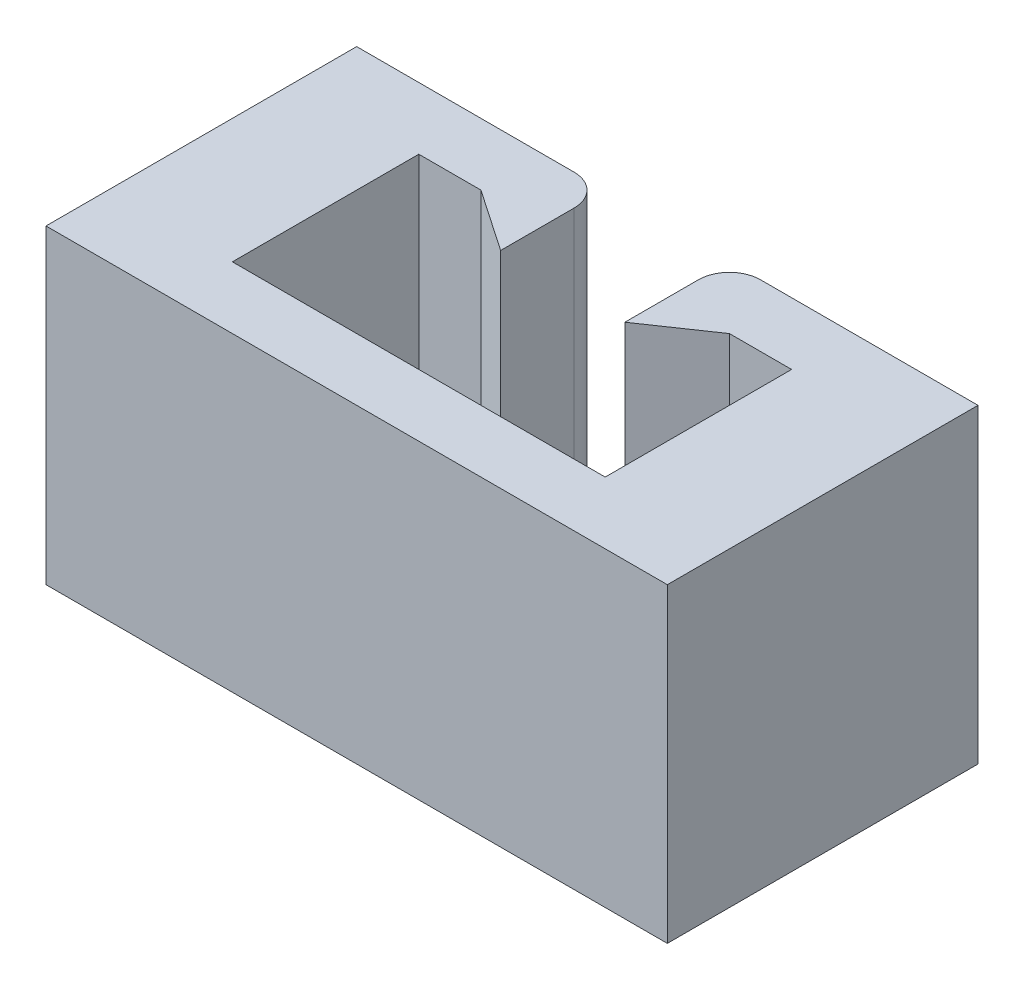
ISO-10303-21;
HEADER;
FILE_DESCRIPTION(('STEP AP214'),'2;1');
FILE_NAME('part.step','',(''),(''),'','','');
FILE_SCHEMA(('AUTOMOTIVE_DESIGN { 1 0 10303 214 1 1 1 1 }'));
ENDSEC;
DATA;
#1=APPLICATION_CONTEXT('core data for automotive mechanical design processes');
#2=APPLICATION_PROTOCOL_DEFINITION('international standard','automotive_design',2000,#1);
#3=PRODUCT_CONTEXT('',#1,'mechanical');
#4=PRODUCT('Part','Part','',(#3));
#5=PRODUCT_RELATED_PRODUCT_CATEGORY('part','',(#4));
#6=PRODUCT_DEFINITION_FORMATION('','',#4);
#7=PRODUCT_DEFINITION_CONTEXT('part definition',#1,'design');
#8=PRODUCT_DEFINITION('design','',#6,#7);
#9=PRODUCT_DEFINITION_SHAPE('','',#8);
#10=(LENGTH_UNIT() NAMED_UNIT(*) SI_UNIT(.MILLI.,.METRE.));
#11=(NAMED_UNIT(*) PLANE_ANGLE_UNIT() SI_UNIT($,.RADIAN.));
#12=(NAMED_UNIT(*) SI_UNIT($,.STERADIAN.) SOLID_ANGLE_UNIT());
#13=UNCERTAINTY_MEASURE_WITH_UNIT(LENGTH_MEASURE(1.E-05),#10,'distance_accuracy_value','');
#14=(GEOMETRIC_REPRESENTATION_CONTEXT(3) GLOBAL_UNCERTAINTY_ASSIGNED_CONTEXT((#13)) GLOBAL_UNIT_ASSIGNED_CONTEXT((#10,
#11,#12)) REPRESENTATION_CONTEXT('',''));
#15=CARTESIAN_POINT('',(0.,0.,0.));
#16=DIRECTION('',(0.,0.,1.));
#17=DIRECTION('',(1.,0.,0.));
#18=AXIS2_PLACEMENT_3D('',#15,#16,#17);
#19=CARTESIAN_POINT('',(1.5,5.,-2.5));
#20=DIRECTION('',(0.,0.,1.));
#21=DIRECTION('',(1.,0.,0.));
#22=AXIS2_PLACEMENT_3D('',#19,#20,#21);
#23=PLANE('',#22);
#24=DIRECTION('',(-1.,0.,0.));
#25=VECTOR('',#24,1.);
#26=CARTESIAN_POINT('',(1.5,0.,-2.5));
#27=LINE('',#26,#25);
#28=CARTESIAN_POINT('',(5.,0.,-2.5));
#29=VERTEX_POINT('',#28);
#30=CARTESIAN_POINT('',(1.5,0.,-2.5));
#31=VERTEX_POINT('',#30);
#32=EDGE_CURVE('E188',#29,#31,#27,.T.);
#33=ORIENTED_EDGE('',*,*,#32,.T.);
#34=DIRECTION('',(0.,-1.,0.));
#35=VECTOR('',#34,1.);
#36=CARTESIAN_POINT('',(1.5,5.,-2.5));
#37=LINE('',#36,#35);
#38=CARTESIAN_POINT('',(1.5,5.,-2.5));
#39=VERTEX_POINT('',#38);
#40=EDGE_CURVE('E11',#39,#31,#37,.T.);
#41=ORIENTED_EDGE('',*,*,#40,.F.);
#42=DIRECTION('',(-1.,0.,0.));
#43=VECTOR('',#42,1.);
#44=CARTESIAN_POINT('',(1.5,5.,-2.5));
#45=LINE('',#44,#43);
#46=CARTESIAN_POINT('',(5.,5.,-2.5));
#47=VERTEX_POINT('',#46);
#48=EDGE_CURVE('E236',#47,#39,#45,.T.);
#49=ORIENTED_EDGE('',*,*,#48,.F.);
#50=DIRECTION('',(0.,-1.,0.));
#51=VECTOR('',#50,1.);
#52=CARTESIAN_POINT('',(5.,5.,-2.5));
#53=LINE('',#52,#51);
#54=EDGE_CURVE('E184',#47,#29,#53,.T.);
#55=ORIENTED_EDGE('',*,*,#54,.T.);
#56=EDGE_LOOP('',(#33,#41,#49,#55));
#57=FACE_BOUND('',#56,.T.);
#58=ADVANCED_FACE('F39',(#57),#23,.F.);
#59=CARTESIAN_POINT('',(1.5,5.,-2.));
#60=DIRECTION('',(0.,-1.,0.));
#61=DIRECTION('',(0.,0.,-1.));
#62=AXIS2_PLACEMENT_3D('',#59,#60,#61);
#63=CYLINDRICAL_SURFACE('',#62,0.5);
#64=CARTESIAN_POINT('',(1.5,0.,-2.));
#65=DIRECTION('',(0.,1.,0.));
#66=DIRECTION('',(0.,0.,1.));
#67=AXIS2_PLACEMENT_3D('',#64,#65,#66);
#68=CIRCLE('',#67,0.5);
#69=CARTESIAN_POINT('',(1.,0.,-2.));
#70=VERTEX_POINT('',#69);
#71=EDGE_CURVE('E192',#31,#70,#68,.T.);
#72=ORIENTED_EDGE('',*,*,#71,.T.);
#73=DIRECTION('',(0.,-1.,0.));
#74=VECTOR('',#73,1.);
#75=CARTESIAN_POINT('',(1.,5.,-2.));
#76=LINE('',#75,#74);
#77=CARTESIAN_POINT('',(1.,5.,-2.));
#78=VERTEX_POINT('',#77);
#79=EDGE_CURVE('E48',#78,#70,#76,.T.);
#80=ORIENTED_EDGE('',*,*,#79,.F.);
#81=CARTESIAN_POINT('',(1.5,5.,-2.));
#82=DIRECTION('',(0.,1.,0.));
#83=DIRECTION('',(0.,0.,1.));
#84=AXIS2_PLACEMENT_3D('',#81,#82,#83);
#85=CIRCLE('',#84,0.5);
#86=EDGE_CURVE('E123',#39,#78,#85,.T.);
#87=ORIENTED_EDGE('',*,*,#86,.F.);
#88=ORIENTED_EDGE('',*,*,#40,.T.);
#89=EDGE_LOOP('',(#72,#80,#87,#88));
#90=FACE_BOUND('',#89,.T.);
#91=ADVANCED_FACE('F289',(#90),#63,.T.);
#92=CARTESIAN_POINT('',(1.,5.,-1.5));
#93=DIRECTION('',(1.,0.,0.));
#94=DIRECTION('',(0.,0.,-1.));
#95=AXIS2_PLACEMENT_3D('',#92,#93,#94);
#96=PLANE('',#95);
#97=DIRECTION('',(0.,0.,1.));
#98=VECTOR('',#97,1.);
#99=CARTESIAN_POINT('',(1.,0.,-1.5));
#100=LINE('',#99,#98);
#101=CARTESIAN_POINT('',(1.,0.,-0.817081844494731));
#102=VERTEX_POINT('',#101);
#103=EDGE_CURVE('E196',#70,#102,#100,.T.);
#104=ORIENTED_EDGE('',*,*,#103,.T.);
#105=DIRECTION('',(0.,-1.,0.));
#106=VECTOR('',#105,1.);
#107=CARTESIAN_POINT('',(1.,5.,-0.817081844494731));
#108=LINE('',#107,#106);
#109=CARTESIAN_POINT('',(1.,5.,-0.817081844494731));
#110=VERTEX_POINT('',#109);
#111=EDGE_CURVE('E279',#110,#102,#108,.T.);
#112=ORIENTED_EDGE('',*,*,#111,.F.);
#113=DIRECTION('',(0.,0.,1.));
#114=VECTOR('',#113,1.);
#115=CARTESIAN_POINT('',(1.,5.,-1.5));
#116=LINE('',#115,#114);
#117=EDGE_CURVE('E288',#78,#110,#116,.T.);
#118=ORIENTED_EDGE('',*,*,#117,.F.);
#119=ORIENTED_EDGE('',*,*,#79,.T.);
#120=EDGE_LOOP('',(#104,#112,#118,#119));
#121=FACE_BOUND('',#120,.T.);
#122=ADVANCED_FACE('F286',(#121),#96,.F.);
#123=CARTESIAN_POINT('',(1.,5.,-0.817081844494731));
#124=DIRECTION('',(-0.563956761474712,0.,-0.825804317733297));
#125=DIRECTION('',(-0.825804317733297,0.,0.563956761474712));
#126=AXIS2_PLACEMENT_3D('',#123,#124,#125);
#127=PLANE('',#126);
#128=DIRECTION('',(0.825804317733296,0.,-0.563956761474712));
#129=VECTOR('',#128,1.);
#130=CARTESIAN_POINT('',(1.,0.,-0.817081844494731));
#131=LINE('',#130,#129);
#132=CARTESIAN_POINT('',(2.,0.,-1.5));
#133=VERTEX_POINT('',#132);
#134=EDGE_CURVE('E199',#102,#133,#131,.T.);
#135=ORIENTED_EDGE('',*,*,#134,.T.);
#136=DIRECTION('',(0.,-1.,0.));
#137=VECTOR('',#136,1.);
#138=CARTESIAN_POINT('',(2.,5.,-1.5));
#139=LINE('',#138,#137);
#140=CARTESIAN_POINT('',(2.,5.,-1.5));
#141=VERTEX_POINT('',#140);
#142=EDGE_CURVE('E275',#141,#133,#139,.T.);
#143=ORIENTED_EDGE('',*,*,#142,.F.);
#144=DIRECTION('',(0.825804317733296,0.,-0.563956761474712));
#145=VECTOR('',#144,1.);
#146=CARTESIAN_POINT('',(1.,5.,-0.817081844494731));
#147=LINE('',#146,#145);
#148=EDGE_CURVE('E309',#110,#141,#147,.T.);
#149=ORIENTED_EDGE('',*,*,#148,.F.);
#150=ORIENTED_EDGE('',*,*,#111,.T.);
#151=EDGE_LOOP('',(#135,#143,#149,#150));
#152=FACE_BOUND('',#151,.T.);
#153=ADVANCED_FACE('F299',(#152),#127,.F.);
#154=CARTESIAN_POINT('',(2.,5.,-1.5));
#155=DIRECTION('',(0.,0.,-1.));
#156=DIRECTION('',(-1.,0.,0.));
#157=AXIS2_PLACEMENT_3D('',#154,#155,#156);
#158=PLANE('',#157);
#159=DIRECTION('',(1.,0.,0.));
#160=VECTOR('',#159,1.);
#161=CARTESIAN_POINT('',(2.,0.,-1.5));
#162=LINE('',#161,#160);
#163=CARTESIAN_POINT('',(3.,0.,-1.5));
#164=VERTEX_POINT('',#163);
#165=EDGE_CURVE('E202',#133,#164,#162,.T.);
#166=ORIENTED_EDGE('',*,*,#165,.T.);
#167=DIRECTION('',(0.,-1.,0.));
#168=VECTOR('',#167,1.);
#169=CARTESIAN_POINT('',(3.,5.,-1.5));
#170=LINE('',#169,#168);
#171=CARTESIAN_POINT('',(3.,5.,-1.5));
#172=VERTEX_POINT('',#171);
#173=EDGE_CURVE('E271',#172,#164,#170,.T.);
#174=ORIENTED_EDGE('',*,*,#173,.F.);
#175=DIRECTION('',(1.,0.,0.));
#176=VECTOR('',#175,1.);
#177=CARTESIAN_POINT('',(2.,5.,-1.5));
#178=LINE('',#177,#176);
#179=EDGE_CURVE('E305',#141,#172,#178,.T.);
#180=ORIENTED_EDGE('',*,*,#179,.F.);
#181=ORIENTED_EDGE('',*,*,#142,.T.);
#182=EDGE_LOOP('',(#166,#174,#180,#181));
#183=FACE_BOUND('',#182,.T.);
#184=ADVANCED_FACE('F303',(#183),#158,.F.);
#185=CARTESIAN_POINT('',(3.,5.,-1.5));
#186=DIRECTION('',(1.,0.,0.));
#187=DIRECTION('',(0.,0.,-1.));
#188=AXIS2_PLACEMENT_3D('',#185,#186,#187);
#189=PLANE('',#188);
#190=DIRECTION('',(0.,0.,1.));
#191=VECTOR('',#190,1.);
#192=CARTESIAN_POINT('',(3.,0.,-1.5));
#193=LINE('',#192,#191);
#194=CARTESIAN_POINT('',(3.,0.,1.5));
#195=VERTEX_POINT('',#194);
#196=EDGE_CURVE('E205',#164,#195,#193,.T.);
#197=ORIENTED_EDGE('',*,*,#196,.T.);
#198=DIRECTION('',(0.,-1.,0.));
#199=VECTOR('',#198,1.);
#200=CARTESIAN_POINT('',(3.,5.,1.5));
#201=LINE('',#200,#199);
#202=CARTESIAN_POINT('',(3.,5.,1.5));
#203=VERTEX_POINT('',#202);
#204=EDGE_CURVE('E267',#203,#195,#201,.T.);
#205=ORIENTED_EDGE('',*,*,#204,.F.);
#206=DIRECTION('',(0.,0.,1.));
#207=VECTOR('',#206,1.);
#208=CARTESIAN_POINT('',(3.,5.,-1.5));
#209=LINE('',#208,#207);
#210=EDGE_CURVE('E308',#172,#203,#209,.T.);
#211=ORIENTED_EDGE('',*,*,#210,.F.);
#212=ORIENTED_EDGE('',*,*,#173,.T.);
#213=EDGE_LOOP('',(#197,#205,#211,#212));
#214=FACE_BOUND('',#213,.T.);
#215=ADVANCED_FACE('F462',(#214),#189,.F.);
#216=CARTESIAN_POINT('',(-3.,5.,1.5));
#217=DIRECTION('',(0.,0.,1.));
#218=DIRECTION('',(1.,0.,0.));
#219=AXIS2_PLACEMENT_3D('',#216,#217,#218);
#220=PLANE('',#219);
#221=DIRECTION('',(-1.,0.,0.));
#222=VECTOR('',#221,1.);
#223=CARTESIAN_POINT('',(-3.,0.,1.5));
#224=LINE('',#223,#222);
#225=CARTESIAN_POINT('',(-3.,0.,1.5));
#226=VERTEX_POINT('',#225);
#227=EDGE_CURVE('E208',#195,#226,#224,.T.);
#228=ORIENTED_EDGE('',*,*,#227,.T.);
#229=DIRECTION('',(0.,-1.,0.));
#230=VECTOR('',#229,1.);
#231=CARTESIAN_POINT('',(-3.,5.,1.5));
#232=LINE('',#231,#230);
#233=CARTESIAN_POINT('',(-3.,5.,1.5));
#234=VERTEX_POINT('',#233);
#235=EDGE_CURVE('E263',#234,#226,#232,.T.);
#236=ORIENTED_EDGE('',*,*,#235,.F.);
#237=DIRECTION('',(-1.,0.,0.));
#238=VECTOR('',#237,1.);
#239=CARTESIAN_POINT('',(-3.,5.,1.5));
#240=LINE('',#239,#238);
#241=EDGE_CURVE('E313',#203,#234,#240,.T.);
#242=ORIENTED_EDGE('',*,*,#241,.F.);
#243=ORIENTED_EDGE('',*,*,#204,.T.);
#244=EDGE_LOOP('',(#228,#236,#242,#243));
#245=FACE_BOUND('',#244,.T.);
#246=ADVANCED_FACE('F452',(#245),#220,.F.);
#247=CARTESIAN_POINT('',(-3.,5.,-1.5));
#248=DIRECTION('',(-1.,0.,0.));
#249=DIRECTION('',(0.,0.,1.));
#250=AXIS2_PLACEMENT_3D('',#247,#248,#249);
#251=PLANE('',#250);
#252=DIRECTION('',(0.,0.,-1.));
#253=VECTOR('',#252,1.);
#254=CARTESIAN_POINT('',(-3.,0.,-1.5));
#255=LINE('',#254,#253);
#256=CARTESIAN_POINT('',(-3.,0.,-1.5));
#257=VERTEX_POINT('',#256);
#258=EDGE_CURVE('E211',#226,#257,#255,.T.);
#259=ORIENTED_EDGE('',*,*,#258,.T.);
#260=DIRECTION('',(0.,-1.,0.));
#261=VECTOR('',#260,1.);
#262=CARTESIAN_POINT('',(-3.,5.,-1.5));
#263=LINE('',#262,#261);
#264=CARTESIAN_POINT('',(-3.,5.,-1.5));
#265=VERTEX_POINT('',#264);
#266=EDGE_CURVE('E259',#265,#257,#263,.T.);
#267=ORIENTED_EDGE('',*,*,#266,.F.);
#268=DIRECTION('',(0.,0.,-1.));
#269=VECTOR('',#268,1.);
#270=CARTESIAN_POINT('',(-3.,5.,-1.5));
#271=LINE('',#270,#269);
#272=EDGE_CURVE('E320',#234,#265,#271,.T.);
#273=ORIENTED_EDGE('',*,*,#272,.F.);
#274=ORIENTED_EDGE('',*,*,#235,.T.);
#275=EDGE_LOOP('',(#259,#267,#273,#274));
#276=FACE_BOUND('',#275,.T.);
#277=ADVANCED_FACE('F442',(#276),#251,.F.);
#278=CARTESIAN_POINT('',(-3.,5.,-1.5));
#279=DIRECTION('',(0.,0.,-1.));
#280=DIRECTION('',(-1.,0.,0.));
#281=AXIS2_PLACEMENT_3D('',#278,#279,#280);
#282=PLANE('',#281);
#283=DIRECTION('',(1.,0.,0.));
#284=VECTOR('',#283,1.);
#285=CARTESIAN_POINT('',(-3.,0.,-1.5));
#286=LINE('',#285,#284);
#287=CARTESIAN_POINT('',(-2.,0.,-1.5));
#288=VERTEX_POINT('',#287);
#289=EDGE_CURVE('E214',#257,#288,#286,.T.);
#290=ORIENTED_EDGE('',*,*,#289,.T.);
#291=DIRECTION('',(0.,-1.,0.));
#292=VECTOR('',#291,1.);
#293=CARTESIAN_POINT('',(-2.,5.,-1.5));
#294=LINE('',#293,#292);
#295=CARTESIAN_POINT('',(-2.,5.,-1.5));
#296=VERTEX_POINT('',#295);
#297=EDGE_CURVE('E255',#296,#288,#294,.T.);
#298=ORIENTED_EDGE('',*,*,#297,.F.);
#299=DIRECTION('',(1.,0.,0.));
#300=VECTOR('',#299,1.);
#301=CARTESIAN_POINT('',(-3.,5.,-1.5));
#302=LINE('',#301,#300);
#303=EDGE_CURVE('E323',#265,#296,#302,.T.);
#304=ORIENTED_EDGE('',*,*,#303,.F.);
#305=ORIENTED_EDGE('',*,*,#266,.T.);
#306=EDGE_LOOP('',(#290,#298,#304,#305));
#307=FACE_BOUND('',#306,.T.);
#308=ADVANCED_FACE('F361',(#307),#282,.F.);
#309=CARTESIAN_POINT('',(-1.,5.,-0.817081844494731));
#310=DIRECTION('',(0.563956761474712,0.,-0.825804317733296));
#311=DIRECTION('',(-0.825804317733296,0.,-0.563956761474712));
#312=AXIS2_PLACEMENT_3D('',#309,#310,#311);
#313=PLANE('',#312);
#314=DIRECTION('',(0.825804317733296,0.,0.563956761474712));
#315=VECTOR('',#314,1.);
#316=CARTESIAN_POINT('',(-1.,0.,-0.817081844494731));
#317=LINE('',#316,#315);
#318=CARTESIAN_POINT('',(-1.,0.,-0.817081844494731));
#319=VERTEX_POINT('',#318);
#320=EDGE_CURVE('E217',#288,#319,#317,.T.);
#321=ORIENTED_EDGE('',*,*,#320,.T.);
#322=DIRECTION('',(0.,-1.,0.));
#323=VECTOR('',#322,1.);
#324=CARTESIAN_POINT('',(-1.,5.,-0.817081844494731));
#325=LINE('',#324,#323);
#326=CARTESIAN_POINT('',(-1.,5.,-0.817081844494731));
#327=VERTEX_POINT('',#326);
#328=EDGE_CURVE('E251',#327,#319,#325,.T.);
#329=ORIENTED_EDGE('',*,*,#328,.F.);
#330=DIRECTION('',(0.825804317733296,0.,0.563956761474712));
#331=VECTOR('',#330,1.);
#332=CARTESIAN_POINT('',(-1.,5.,-0.817081844494731));
#333=LINE('',#332,#331);
#334=EDGE_CURVE('E326',#296,#327,#333,.T.);
#335=ORIENTED_EDGE('',*,*,#334,.F.);
#336=ORIENTED_EDGE('',*,*,#297,.T.);
#337=EDGE_LOOP('',(#321,#329,#335,#336));
#338=FACE_BOUND('',#337,.T.);
#339=ADVANCED_FACE('F350',(#338),#313,.F.);
#340=CARTESIAN_POINT('',(-1.,5.,-1.5));
#341=DIRECTION('',(-1.,0.,0.));
#342=DIRECTION('',(0.,0.,1.));
#343=AXIS2_PLACEMENT_3D('',#340,#341,#342);
#344=PLANE('',#343);
#345=DIRECTION('',(0.,0.,-1.));
#346=VECTOR('',#345,1.);
#347=CARTESIAN_POINT('',(-1.,0.,-1.5));
#348=LINE('',#347,#346);
#349=CARTESIAN_POINT('',(-1.,0.,-2.));
#350=VERTEX_POINT('',#349);
#351=EDGE_CURVE('E221',#319,#350,#348,.T.);
#352=ORIENTED_EDGE('',*,*,#351,.T.);
#353=DIRECTION('',(0.,-1.,0.));
#354=VECTOR('',#353,1.);
#355=CARTESIAN_POINT('',(-1.,5.,-2.));
#356=LINE('',#355,#354);
#357=CARTESIAN_POINT('',(-1.,5.,-2.));
#358=VERTEX_POINT('',#357);
#359=EDGE_CURVE('E247',#358,#350,#356,.T.);
#360=ORIENTED_EDGE('',*,*,#359,.F.);
#361=DIRECTION('',(0.,0.,-1.));
#362=VECTOR('',#361,1.);
#363=CARTESIAN_POINT('',(-1.,5.,-1.5));
#364=LINE('',#363,#362);
#365=EDGE_CURVE('E329',#327,#358,#364,.T.);
#366=ORIENTED_EDGE('',*,*,#365,.F.);
#367=ORIENTED_EDGE('',*,*,#328,.T.);
#368=EDGE_LOOP('',(#352,#360,#366,#367));
#369=FACE_BOUND('',#368,.T.);
#370=ADVANCED_FACE('F353',(#369),#344,.F.);
#371=CARTESIAN_POINT('',(-1.5,5.,-2.));
#372=DIRECTION('',(0.,-1.,0.));
#373=DIRECTION('',(0.,0.,-1.));
#374=AXIS2_PLACEMENT_3D('',#371,#372,#373);
#375=CYLINDRICAL_SURFACE('',#374,0.5);
#376=CARTESIAN_POINT('',(-1.5,0.,-2.));
#377=DIRECTION('',(0.,1.,0.));
#378=DIRECTION('',(0.,0.,1.));
#379=AXIS2_PLACEMENT_3D('',#376,#377,#378);
#380=CIRCLE('',#379,0.5);
#381=CARTESIAN_POINT('',(-1.5,0.,-2.5));
#382=VERTEX_POINT('',#381);
#383=EDGE_CURVE('E224',#350,#382,#380,.T.);
#384=ORIENTED_EDGE('',*,*,#383,.T.);
#385=DIRECTION('',(0.,-1.,0.));
#386=VECTOR('',#385,1.);
#387=CARTESIAN_POINT('',(-1.5,5.,-2.5));
#388=LINE('',#387,#386);
#389=CARTESIAN_POINT('',(-1.5,5.,-2.5));
#390=VERTEX_POINT('',#389);
#391=EDGE_CURVE('E243',#390,#382,#388,.T.);
#392=ORIENTED_EDGE('',*,*,#391,.F.);
#393=CARTESIAN_POINT('',(-1.5,5.,-2.));
#394=DIRECTION('',(0.,1.,0.));
#395=DIRECTION('',(0.,0.,1.));
#396=AXIS2_PLACEMENT_3D('',#393,#394,#395);
#397=CIRCLE('',#396,0.5);
#398=EDGE_CURVE('E332',#358,#390,#397,.T.);
#399=ORIENTED_EDGE('',*,*,#398,.F.);
#400=ORIENTED_EDGE('',*,*,#359,.T.);
#401=EDGE_LOOP('',(#384,#392,#399,#400));
#402=FACE_BOUND('',#401,.T.);
#403=ADVANCED_FACE('F340',(#402),#375,.T.);
#404=CARTESIAN_POINT('',(-5.,5.,-2.5));
#405=DIRECTION('',(0.,0.,1.));
#406=DIRECTION('',(1.,0.,0.));
#407=AXIS2_PLACEMENT_3D('',#404,#405,#406);
#408=PLANE('',#407);
#409=DIRECTION('',(-1.,0.,0.));
#410=VECTOR('',#409,1.);
#411=CARTESIAN_POINT('',(-5.,0.,-2.5));
#412=LINE('',#411,#410);
#413=CARTESIAN_POINT('',(-5.,0.,-2.5));
#414=VERTEX_POINT('',#413);
#415=EDGE_CURVE('E227',#382,#414,#412,.T.);
#416=ORIENTED_EDGE('',*,*,#415,.T.);
#417=DIRECTION('',(0.,-1.,0.));
#418=VECTOR('',#417,1.);
#419=CARTESIAN_POINT('',(-5.,5.,-2.5));
#420=LINE('',#419,#418);
#421=CARTESIAN_POINT('',(-5.,5.,-2.5));
#422=VERTEX_POINT('',#421);
#423=EDGE_CURVE('E177',#422,#414,#420,.T.);
#424=ORIENTED_EDGE('',*,*,#423,.F.);
#425=DIRECTION('',(-1.,0.,0.));
#426=VECTOR('',#425,1.);
#427=CARTESIAN_POINT('',(-5.,5.,-2.5));
#428=LINE('',#427,#426);
#429=EDGE_CURVE('E166',#390,#422,#428,.T.);
#430=ORIENTED_EDGE('',*,*,#429,.F.);
#431=ORIENTED_EDGE('',*,*,#391,.T.);
#432=EDGE_LOOP('',(#416,#424,#430,#431));
#433=FACE_BOUND('',#432,.T.);
#434=ADVANCED_FACE('F344',(#433),#408,.F.);
#435=CARTESIAN_POINT('',(-5.,5.,2.5));
#436=DIRECTION('',(1.,0.,0.));
#437=DIRECTION('',(0.,0.,-1.));
#438=AXIS2_PLACEMENT_3D('',#435,#436,#437);
#439=PLANE('',#438);
#440=DIRECTION('',(0.,0.,1.));
#441=VECTOR('',#440,1.);
#442=CARTESIAN_POINT('',(-5.,0.,2.5));
#443=LINE('',#442,#441);
#444=CARTESIAN_POINT('',(-5.,0.,2.5));
#445=VERTEX_POINT('',#444);
#446=EDGE_CURVE('E175',#414,#445,#443,.T.);
#447=ORIENTED_EDGE('',*,*,#446,.T.);
#448=DIRECTION('',(0.,-1.,0.));
#449=VECTOR('',#448,1.);
#450=CARTESIAN_POINT('',(-5.,5.,2.5));
#451=LINE('',#450,#449);
#452=CARTESIAN_POINT('',(-5.,5.,2.5));
#453=VERTEX_POINT('',#452);
#454=EDGE_CURVE('E172',#453,#445,#451,.T.);
#455=ORIENTED_EDGE('',*,*,#454,.F.);
#456=DIRECTION('',(0.,0.,1.));
#457=VECTOR('',#456,1.);
#458=CARTESIAN_POINT('',(-5.,5.,2.5));
#459=LINE('',#458,#457);
#460=EDGE_CURVE('E160',#422,#453,#459,.T.);
#461=ORIENTED_EDGE('',*,*,#460,.F.);
#462=ORIENTED_EDGE('',*,*,#423,.T.);
#463=EDGE_LOOP('',(#447,#455,#461,#462));
#464=FACE_BOUND('',#463,.T.);
#465=ADVANCED_FACE('F173',(#464),#439,.F.);
#466=CARTESIAN_POINT('',(-5.,5.,2.5));
#467=DIRECTION('',(0.,0.,-1.));
#468=DIRECTION('',(-1.,0.,0.));
#469=AXIS2_PLACEMENT_3D('',#466,#467,#468);
#470=PLANE('',#469);
#471=DIRECTION('',(1.,0.,0.));
#472=VECTOR('',#471,1.);
#473=CARTESIAN_POINT('',(-5.,0.,2.5));
#474=LINE('',#473,#472);
#475=CARTESIAN_POINT('',(5.,0.,2.5));
#476=VERTEX_POINT('',#475);
#477=EDGE_CURVE('E109',#445,#476,#474,.T.);
#478=ORIENTED_EDGE('',*,*,#477,.T.);
#479=DIRECTION('',(0.,-1.,0.));
#480=VECTOR('',#479,1.);
#481=CARTESIAN_POINT('',(5.,5.,2.5));
#482=LINE('',#481,#480);
#483=CARTESIAN_POINT('',(5.,5.,2.5));
#484=VERTEX_POINT('',#483);
#485=EDGE_CURVE('E178',#484,#476,#482,.T.);
#486=ORIENTED_EDGE('',*,*,#485,.F.);
#487=DIRECTION('',(1.,0.,0.));
#488=VECTOR('',#487,1.);
#489=CARTESIAN_POINT('',(-5.,5.,2.5));
#490=LINE('',#489,#488);
#491=EDGE_CURVE('E164',#453,#484,#490,.T.);
#492=ORIENTED_EDGE('',*,*,#491,.F.);
#493=ORIENTED_EDGE('',*,*,#454,.T.);
#494=EDGE_LOOP('',(#478,#486,#492,#493));
#495=FACE_BOUND('',#494,.T.);
#496=ADVANCED_FACE('F180',(#495),#470,.F.);
#497=CARTESIAN_POINT('',(5.,5.,2.5));
#498=DIRECTION('',(-1.,0.,0.));
#499=DIRECTION('',(0.,0.,1.));
#500=AXIS2_PLACEMENT_3D('',#497,#498,#499);
#501=PLANE('',#500);
#502=DIRECTION('',(0.,0.,-1.));
#503=VECTOR('',#502,1.);
#504=CARTESIAN_POINT('',(5.,0.,2.5));
#505=LINE('',#504,#503);
#506=EDGE_CURVE('E115',#476,#29,#505,.T.);
#507=ORIENTED_EDGE('',*,*,#506,.T.);
#508=ORIENTED_EDGE('',*,*,#54,.F.);
#509=DIRECTION('',(0.,0.,-1.));
#510=VECTOR('',#509,1.);
#511=CARTESIAN_POINT('',(5.,5.,2.5));
#512=LINE('',#511,#510);
#513=EDGE_CURVE('E56',#484,#47,#512,.T.);
#514=ORIENTED_EDGE('',*,*,#513,.F.);
#515=ORIENTED_EDGE('',*,*,#485,.T.);
#516=EDGE_LOOP('',(#507,#508,#514,#515));
#517=FACE_BOUND('',#516,.T.);
#518=ADVANCED_FACE('F369',(#517),#501,.F.);
#519=CARTESIAN_POINT('',(-1.5,5.,-2.));
#520=DIRECTION('',(0.,1.,0.));
#521=DIRECTION('',(0.,0.,1.));
#522=AXIS2_PLACEMENT_3D('',#519,#520,#521);
#523=PLANE('',#522);
#524=ORIENTED_EDGE('',*,*,#48,.T.);
#525=ORIENTED_EDGE('',*,*,#86,.T.);
#526=ORIENTED_EDGE('',*,*,#117,.T.);
#527=ORIENTED_EDGE('',*,*,#148,.T.);
#528=ORIENTED_EDGE('',*,*,#179,.T.);
#529=ORIENTED_EDGE('',*,*,#210,.T.);
#530=ORIENTED_EDGE('',*,*,#241,.T.);
#531=ORIENTED_EDGE('',*,*,#272,.T.);
#532=ORIENTED_EDGE('',*,*,#303,.T.);
#533=ORIENTED_EDGE('',*,*,#334,.T.);
#534=ORIENTED_EDGE('',*,*,#365,.T.);
#535=ORIENTED_EDGE('',*,*,#398,.T.);
#536=ORIENTED_EDGE('',*,*,#429,.T.);
#537=ORIENTED_EDGE('',*,*,#460,.T.);
#538=ORIENTED_EDGE('',*,*,#491,.T.);
#539=ORIENTED_EDGE('',*,*,#513,.T.);
#540=EDGE_LOOP('',(#524,#525,#526,#527,#528,#529,#530,#531,#532,#533,#534,#535,#536,#537,#538,#539));
#541=FACE_BOUND('',#540,.T.);
#542=ADVANCED_FACE('F162',(#541),#523,.T.);
#543=CARTESIAN_POINT('',(-1.5,0.,-2.));
#544=DIRECTION('',(0.,1.,0.));
#545=DIRECTION('',(0.,0.,1.));
#546=AXIS2_PLACEMENT_3D('',#543,#544,#545);
#547=PLANE('',#546);
#548=ORIENTED_EDGE('',*,*,#32,.F.);
#549=ORIENTED_EDGE('',*,*,#506,.F.);
#550=ORIENTED_EDGE('',*,*,#477,.F.);
#551=ORIENTED_EDGE('',*,*,#446,.F.);
#552=ORIENTED_EDGE('',*,*,#415,.F.);
#553=ORIENTED_EDGE('',*,*,#383,.F.);
#554=ORIENTED_EDGE('',*,*,#351,.F.);
#555=ORIENTED_EDGE('',*,*,#320,.F.);
#556=ORIENTED_EDGE('',*,*,#289,.F.);
#557=ORIENTED_EDGE('',*,*,#258,.F.);
#558=ORIENTED_EDGE('',*,*,#227,.F.);
#559=ORIENTED_EDGE('',*,*,#196,.F.);
#560=ORIENTED_EDGE('',*,*,#165,.F.);
#561=ORIENTED_EDGE('',*,*,#134,.F.);
#562=ORIENTED_EDGE('',*,*,#103,.F.);
#563=ORIENTED_EDGE('',*,*,#71,.F.);
#564=EDGE_LOOP('',(#548,#549,#550,#551,#552,#553,#554,#555,#556,#557,#558,#559,#560,#561,#562,#563));
#565=FACE_BOUND('',#564,.T.);
#566=ADVANCED_FACE('F293',(#565),#547,.F.);
#567=CLOSED_SHELL('',(#58,#91,#122,#153,#184,#215,#246,#277,#308,#339,#370,#403,#434,#465,#496,
#518,#542,#566));
#568=MANIFOLD_SOLID_BREP('B2',#567);
#569=ADVANCED_BREP_SHAPE_REPRESENTATION('',(#18,#568),#14);
#570=SHAPE_DEFINITION_REPRESENTATION(#9,#569);
ENDSEC;
END-ISO-10303-21;
